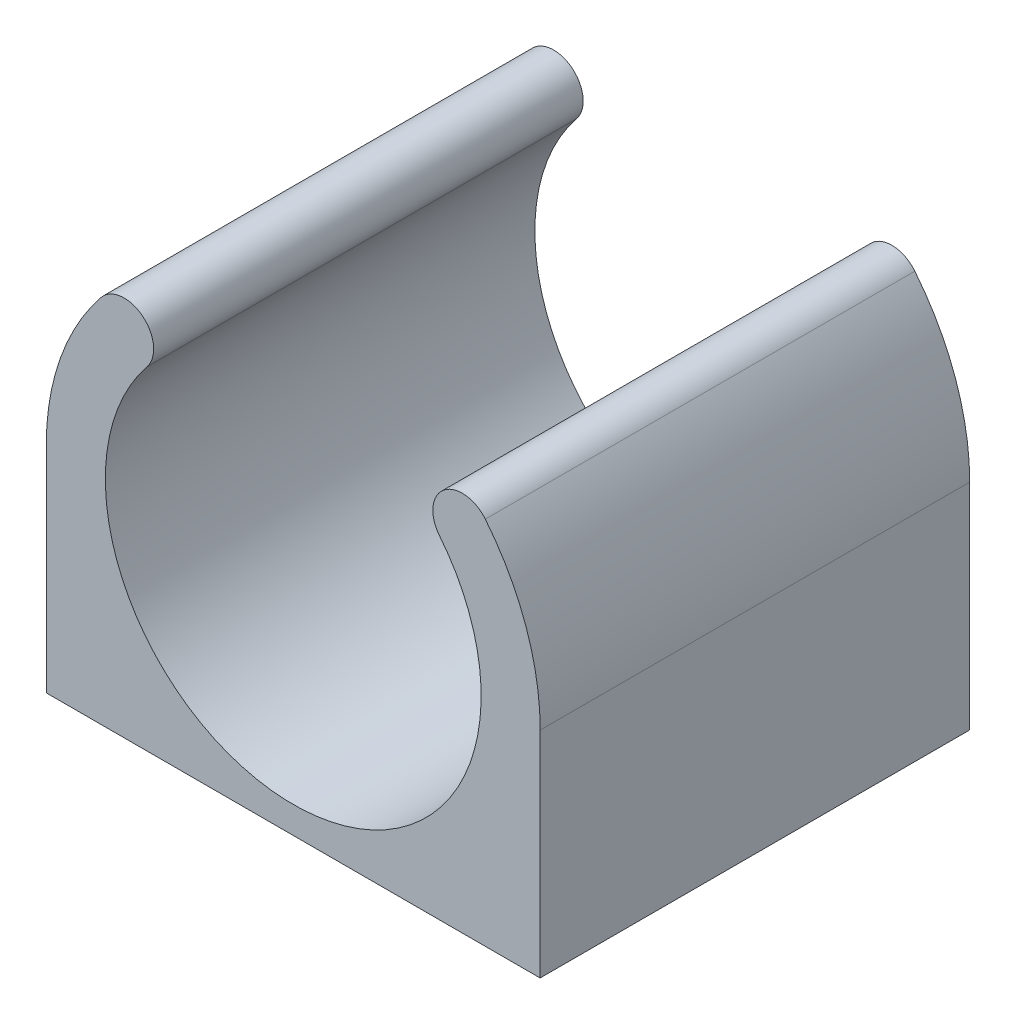
ISO-10303-21;
HEADER;
FILE_DESCRIPTION(('STEP AP214'),'2;1');
FILE_NAME('part.step','',(''),(''),'','','');
FILE_SCHEMA(('AUTOMOTIVE_DESIGN { 1 0 10303 214 1 1 1 1 }'));
ENDSEC;
DATA;
#1=APPLICATION_CONTEXT('core data for automotive mechanical design processes');
#2=APPLICATION_PROTOCOL_DEFINITION('international standard','automotive_design',2000,#1);
#3=PRODUCT_CONTEXT('',#1,'mechanical');
#4=PRODUCT('Part','Part','',(#3));
#5=PRODUCT_RELATED_PRODUCT_CATEGORY('part','',(#4));
#6=PRODUCT_DEFINITION_FORMATION('','',#4);
#7=PRODUCT_DEFINITION_CONTEXT('part definition',#1,'design');
#8=PRODUCT_DEFINITION('design','',#6,#7);
#9=PRODUCT_DEFINITION_SHAPE('','',#8);
#10=(LENGTH_UNIT() NAMED_UNIT(*) SI_UNIT(.MILLI.,.METRE.));
#11=(NAMED_UNIT(*) PLANE_ANGLE_UNIT() SI_UNIT($,.RADIAN.));
#12=(NAMED_UNIT(*) SI_UNIT($,.STERADIAN.) SOLID_ANGLE_UNIT());
#13=UNCERTAINTY_MEASURE_WITH_UNIT(LENGTH_MEASURE(1.E-05),#10,'distance_accuracy_value','');
#14=(GEOMETRIC_REPRESENTATION_CONTEXT(3) GLOBAL_UNCERTAINTY_ASSIGNED_CONTEXT((#13)) GLOBAL_UNIT_ASSIGNED_CONTEXT((#10,
#11,#12)) REPRESENTATION_CONTEXT('',''));
#15=CARTESIAN_POINT('',(0.,0.,0.));
#16=DIRECTION('',(0.,0.,1.));
#17=DIRECTION('',(1.,0.,0.));
#18=AXIS2_PLACEMENT_3D('',#15,#16,#17);
#19=CARTESIAN_POINT('',(2.29908340710687,-2.,4.));
#20=DIRECTION('',(-0.9999998949822,0.000458296398436851,0.));
#21=DIRECTION('',(-0.000458296398436851,-0.9999998949822,0.));
#22=AXIS2_PLACEMENT_3D('',#19,#20,#21);
#23=PLANE('',#22);
#24=DIRECTION('',(0.000458296398436851,0.9999998949822,0.));
#25=VECTOR('',#24,1.);
#26=CARTESIAN_POINT('',(2.29908340710687,-2.,0.));
#27=LINE('',#26,#25);
#28=CARTESIAN_POINT('',(2.29908340710687,-2.,0.));
#29=VERTEX_POINT('',#28);
#30=CARTESIAN_POINT('',(2.3,0.,0.));
#31=VERTEX_POINT('',#30);
#32=EDGE_CURVE('E140',#29,#31,#27,.T.);
#33=ORIENTED_EDGE('',*,*,#32,.T.);
#34=DIRECTION('',(0.,0.,-1.));
#35=VECTOR('',#34,1.);
#36=CARTESIAN_POINT('',(2.3,0.,4.));
#37=LINE('',#36,#35);
#38=CARTESIAN_POINT('',(2.3,0.,4.));
#39=VERTEX_POINT('',#38);
#40=EDGE_CURVE('E11',#39,#31,#37,.T.);
#41=ORIENTED_EDGE('',*,*,#40,.F.);
#42=DIRECTION('',(0.000458296398436851,0.9999998949822,0.));
#43=VECTOR('',#42,1.);
#44=CARTESIAN_POINT('',(2.29908340710687,-2.,4.));
#45=LINE('',#44,#43);
#46=CARTESIAN_POINT('',(2.29908340710687,-2.,4.));
#47=VERTEX_POINT('',#46);
#48=EDGE_CURVE('E162',#47,#39,#45,.T.);
#49=ORIENTED_EDGE('',*,*,#48,.F.);
#50=DIRECTION('',(0.,0.,-1.));
#51=VECTOR('',#50,1.);
#52=CARTESIAN_POINT('',(2.29908340710687,-2.,4.));
#53=LINE('',#52,#51);
#54=EDGE_CURVE('E136',#47,#29,#53,.T.);
#55=ORIENTED_EDGE('',*,*,#54,.T.);
#56=EDGE_LOOP('',(#33,#41,#49,#55));
#57=FACE_BOUND('',#56,.T.);
#58=ADVANCED_FACE('F39',(#57),#23,.F.);
#59=CARTESIAN_POINT('',(0.,0.,4.));
#60=DIRECTION('',(0.,0.,-1.));
#61=DIRECTION('',(-1.,0.,0.));
#62=AXIS2_PLACEMENT_3D('',#59,#60,#61);
#63=CYLINDRICAL_SURFACE('',#62,2.3);
#64=CARTESIAN_POINT('',(0.,0.,0.));
#65=DIRECTION('',(0.,0.,1.));
#66=DIRECTION('',(1.,0.,0.));
#67=AXIS2_PLACEMENT_3D('',#64,#65,#66);
#68=CIRCLE('',#67,2.3);
#69=CARTESIAN_POINT('',(1.78882928310156,1.44571428571429,0.));
#70=VERTEX_POINT('',#69);
#71=EDGE_CURVE('E144',#31,#70,#68,.T.);
#72=ORIENTED_EDGE('',*,*,#71,.T.);
#73=DIRECTION('',(0.,0.,-1.));
#74=VECTOR('',#73,1.);
#75=CARTESIAN_POINT('',(1.78882928310156,1.44571428571429,4.));
#76=LINE('',#75,#74);
#77=CARTESIAN_POINT('',(1.78882928310156,1.44571428571429,4.));
#78=VERTEX_POINT('',#77);
#79=EDGE_CURVE('E48',#78,#70,#76,.T.);
#80=ORIENTED_EDGE('',*,*,#79,.F.);
#81=CARTESIAN_POINT('',(0.,0.,4.));
#82=DIRECTION('',(0.,0.,1.));
#83=DIRECTION('',(1.,0.,0.));
#84=AXIS2_PLACEMENT_3D('',#81,#82,#83);
#85=CIRCLE('',#84,2.3);
#86=EDGE_CURVE('E99',#39,#78,#85,.T.);
#87=ORIENTED_EDGE('',*,*,#86,.F.);
#88=ORIENTED_EDGE('',*,*,#40,.T.);
#89=EDGE_LOOP('',(#72,#80,#87,#88));
#90=FACE_BOUND('',#89,.T.);
#91=ADVANCED_FACE('F208',(#90),#63,.T.);
#92=CARTESIAN_POINT('',(1.57494752099159,1.27285714285714,4.));
#93=DIRECTION('',(0.,0.,-1.));
#94=DIRECTION('',(-1.,0.,0.));
#95=AXIS2_PLACEMENT_3D('',#92,#93,#94);
#96=CYLINDRICAL_SURFACE('',#95,0.275);
#97=CARTESIAN_POINT('',(1.57494752099159,1.27285714285714,0.));
#98=DIRECTION('',(0.,0.,1.));
#99=DIRECTION('',(-1.,0.,0.));
#100=AXIS2_PLACEMENT_3D('',#97,#98,#99);
#101=CIRCLE('',#100,0.275);
#102=CARTESIAN_POINT('',(1.36106575888162,1.1,0.));
#103=VERTEX_POINT('',#102);
#104=EDGE_CURVE('E147',#70,#103,#101,.T.);
#105=ORIENTED_EDGE('',*,*,#104,.T.);
#106=DIRECTION('',(0.,0.,-1.));
#107=VECTOR('',#106,1.);
#108=CARTESIAN_POINT('',(1.36106575888162,1.1,4.));
#109=LINE('',#108,#107);
#110=CARTESIAN_POINT('',(1.36106575888162,1.1,4.));
#111=VERTEX_POINT('',#110);
#112=EDGE_CURVE('E173',#111,#103,#109,.T.);
#113=ORIENTED_EDGE('',*,*,#112,.F.);
#114=CARTESIAN_POINT('',(1.57494752099159,1.27285714285714,4.));
#115=DIRECTION('',(0.,0.,1.));
#116=DIRECTION('',(-1.,0.,0.));
#117=AXIS2_PLACEMENT_3D('',#114,#115,#116);
#118=CIRCLE('',#117,0.275);
#119=EDGE_CURVE('E183',#78,#111,#118,.T.);
#120=ORIENTED_EDGE('',*,*,#119,.F.);
#121=ORIENTED_EDGE('',*,*,#79,.T.);
#122=EDGE_LOOP('',(#105,#113,#120,#121));
#123=FACE_BOUND('',#122,.T.);
#124=ADVANCED_FACE('F181',(#123),#96,.T.);
#125=CARTESIAN_POINT('',(0.,0.,4.));
#126=DIRECTION('',(0.,0.,-1.));
#127=DIRECTION('',(-1.,0.,0.));
#128=AXIS2_PLACEMENT_3D('',#125,#126,#127);
#129=CYLINDRICAL_SURFACE('',#128,1.75);
#130=CARTESIAN_POINT('',(0.,0.,0.));
#131=DIRECTION('',(0.,0.,-1.));
#132=DIRECTION('',(1.,0.,0.));
#133=AXIS2_PLACEMENT_3D('',#130,#131,#132);
#134=CIRCLE('',#133,1.75);
#135=CARTESIAN_POINT('',(-1.36106575888162,1.1,0.));
#136=VERTEX_POINT('',#135);
#137=EDGE_CURVE('E150',#103,#136,#134,.T.);
#138=ORIENTED_EDGE('',*,*,#137,.T.);
#139=DIRECTION('',(0.,0.,-1.));
#140=VECTOR('',#139,1.);
#141=CARTESIAN_POINT('',(-1.36106575888162,1.1,4.));
#142=LINE('',#141,#140);
#143=CARTESIAN_POINT('',(-1.36106575888162,1.1,4.));
#144=VERTEX_POINT('',#143);
#145=EDGE_CURVE('E169',#144,#136,#142,.T.);
#146=ORIENTED_EDGE('',*,*,#145,.F.);
#147=CARTESIAN_POINT('',(0.,0.,4.));
#148=DIRECTION('',(0.,0.,-1.));
#149=DIRECTION('',(1.,0.,0.));
#150=AXIS2_PLACEMENT_3D('',#147,#148,#149);
#151=CIRCLE('',#150,1.75);
#152=EDGE_CURVE('E196',#111,#144,#151,.T.);
#153=ORIENTED_EDGE('',*,*,#152,.F.);
#154=ORIENTED_EDGE('',*,*,#112,.T.);
#155=EDGE_LOOP('',(#138,#146,#153,#154));
#156=FACE_BOUND('',#155,.T.);
#157=ADVANCED_FACE('F191',(#156),#129,.F.);
#158=CARTESIAN_POINT('',(-1.57494752099159,1.27285714285714,4.));
#159=DIRECTION('',(0.,0.,-1.));
#160=DIRECTION('',(-1.,0.,0.));
#161=AXIS2_PLACEMENT_3D('',#158,#159,#160);
#162=CYLINDRICAL_SURFACE('',#161,0.275);
#163=CARTESIAN_POINT('',(-1.57494752099159,1.27285714285714,0.));
#164=DIRECTION('',(0.,0.,1.));
#165=DIRECTION('',(1.,0.,0.));
#166=AXIS2_PLACEMENT_3D('',#163,#164,#165);
#167=CIRCLE('',#166,0.275);
#168=CARTESIAN_POINT('',(-1.78882928310156,1.44571428571429,0.));
#169=VERTEX_POINT('',#168);
#170=EDGE_CURVE('E153',#136,#169,#167,.T.);
#171=ORIENTED_EDGE('',*,*,#170,.T.);
#172=DIRECTION('',(0.,0.,-1.));
#173=VECTOR('',#172,1.);
#174=CARTESIAN_POINT('',(-1.78882928310156,1.44571428571429,4.));
#175=LINE('',#174,#173);
#176=CARTESIAN_POINT('',(-1.78882928310156,1.44571428571429,4.));
#177=VERTEX_POINT('',#176);
#178=EDGE_CURVE('E129',#177,#169,#175,.T.);
#179=ORIENTED_EDGE('',*,*,#178,.F.);
#180=CARTESIAN_POINT('',(-1.57494752099159,1.27285714285714,4.));
#181=DIRECTION('',(0.,0.,1.));
#182=DIRECTION('',(1.,0.,0.));
#183=AXIS2_PLACEMENT_3D('',#180,#181,#182);
#184=CIRCLE('',#183,0.275);
#185=EDGE_CURVE('E118',#144,#177,#184,.T.);
#186=ORIENTED_EDGE('',*,*,#185,.F.);
#187=ORIENTED_EDGE('',*,*,#145,.T.);
#188=EDGE_LOOP('',(#171,#179,#186,#187));
#189=FACE_BOUND('',#188,.T.);
#190=ADVANCED_FACE('F194',(#189),#162,.T.);
#191=CARTESIAN_POINT('',(0.,0.,4.));
#192=DIRECTION('',(0.,0.,-1.));
#193=DIRECTION('',(-1.,0.,0.));
#194=AXIS2_PLACEMENT_3D('',#191,#192,#193);
#195=CYLINDRICAL_SURFACE('',#194,2.3);
#196=CARTESIAN_POINT('',(0.,0.,0.));
#197=DIRECTION('',(0.,0.,1.));
#198=DIRECTION('',(1.,0.,0.));
#199=AXIS2_PLACEMENT_3D('',#196,#197,#198);
#200=CIRCLE('',#199,2.3);
#201=CARTESIAN_POINT('',(-2.3,0.,0.));
#202=VERTEX_POINT('',#201);
#203=EDGE_CURVE('E127',#169,#202,#200,.T.);
#204=ORIENTED_EDGE('',*,*,#203,.T.);
#205=DIRECTION('',(0.,0.,-1.));
#206=VECTOR('',#205,1.);
#207=CARTESIAN_POINT('',(-2.3,0.,4.));
#208=LINE('',#207,#206);
#209=CARTESIAN_POINT('',(-2.3,0.,4.));
#210=VERTEX_POINT('',#209);
#211=EDGE_CURVE('E124',#210,#202,#208,.T.);
#212=ORIENTED_EDGE('',*,*,#211,.F.);
#213=CARTESIAN_POINT('',(0.,0.,4.));
#214=DIRECTION('',(0.,0.,1.));
#215=DIRECTION('',(1.,0.,0.));
#216=AXIS2_PLACEMENT_3D('',#213,#214,#215);
#217=CIRCLE('',#216,2.3);
#218=EDGE_CURVE('E112',#177,#210,#217,.T.);
#219=ORIENTED_EDGE('',*,*,#218,.F.);
#220=ORIENTED_EDGE('',*,*,#178,.T.);
#221=EDGE_LOOP('',(#204,#212,#219,#220));
#222=FACE_BOUND('',#221,.T.);
#223=ADVANCED_FACE('F125',(#222),#195,.T.);
#224=CARTESIAN_POINT('',(-2.29908340710687,-2.,4.));
#225=DIRECTION('',(0.9999998949822,0.000458296398437288,0.));
#226=DIRECTION('',(-0.000458296398437288,0.9999998949822,0.));
#227=AXIS2_PLACEMENT_3D('',#224,#225,#226);
#228=PLANE('',#227);
#229=DIRECTION('',(0.000458296398437288,-0.9999998949822,0.));
#230=VECTOR('',#229,1.);
#231=CARTESIAN_POINT('',(-2.29908340710687,-2.,0.));
#232=LINE('',#231,#230);
#233=CARTESIAN_POINT('',(-2.29908340710687,-2.,0.));
#234=VERTEX_POINT('',#233);
#235=EDGE_CURVE('E85',#202,#234,#232,.T.);
#236=ORIENTED_EDGE('',*,*,#235,.T.);
#237=DIRECTION('',(0.,0.,-1.));
#238=VECTOR('',#237,1.);
#239=CARTESIAN_POINT('',(-2.29908340710687,-2.,4.));
#240=LINE('',#239,#238);
#241=CARTESIAN_POINT('',(-2.29908340710687,-2.,4.));
#242=VERTEX_POINT('',#241);
#243=EDGE_CURVE('E130',#242,#234,#240,.T.);
#244=ORIENTED_EDGE('',*,*,#243,.F.);
#245=DIRECTION('',(0.000458296398437288,-0.9999998949822,0.));
#246=VECTOR('',#245,1.);
#247=CARTESIAN_POINT('',(-2.29908340710687,-2.,4.));
#248=LINE('',#247,#246);
#249=EDGE_CURVE('E116',#210,#242,#248,.T.);
#250=ORIENTED_EDGE('',*,*,#249,.F.);
#251=ORIENTED_EDGE('',*,*,#211,.T.);
#252=EDGE_LOOP('',(#236,#244,#250,#251));
#253=FACE_BOUND('',#252,.T.);
#254=ADVANCED_FACE('F132',(#253),#228,.F.);
#255=CARTESIAN_POINT('',(-2.29908340710687,-2.,4.));
#256=DIRECTION('',(0.,1.,0.));
#257=DIRECTION('',(0.,0.,1.));
#258=AXIS2_PLACEMENT_3D('',#255,#256,#257);
#259=PLANE('',#258);
#260=DIRECTION('',(1.,0.,0.));
#261=VECTOR('',#260,1.);
#262=CARTESIAN_POINT('',(-2.29908340710687,-2.,0.));
#263=LINE('',#262,#261);
#264=EDGE_CURVE('E91',#234,#29,#263,.T.);
#265=ORIENTED_EDGE('',*,*,#264,.T.);
#266=ORIENTED_EDGE('',*,*,#54,.F.);
#267=DIRECTION('',(1.,0.,0.));
#268=VECTOR('',#267,1.);
#269=CARTESIAN_POINT('',(-2.29908340710687,-2.,4.));
#270=LINE('',#269,#268);
#271=EDGE_CURVE('E56',#242,#47,#270,.T.);
#272=ORIENTED_EDGE('',*,*,#271,.F.);
#273=ORIENTED_EDGE('',*,*,#243,.T.);
#274=EDGE_LOOP('',(#265,#266,#272,#273));
#275=FACE_BOUND('',#274,.T.);
#276=ADVANCED_FACE('F224',(#275),#259,.F.);
#277=CARTESIAN_POINT('',(0.,0.,4.));
#278=DIRECTION('',(0.,0.,1.));
#279=DIRECTION('',(1.,0.,0.));
#280=AXIS2_PLACEMENT_3D('',#277,#278,#279);
#281=PLANE('',#280);
#282=ORIENTED_EDGE('',*,*,#48,.T.);
#283=ORIENTED_EDGE('',*,*,#86,.T.);
#284=ORIENTED_EDGE('',*,*,#119,.T.);
#285=ORIENTED_EDGE('',*,*,#152,.T.);
#286=ORIENTED_EDGE('',*,*,#185,.T.);
#287=ORIENTED_EDGE('',*,*,#218,.T.);
#288=ORIENTED_EDGE('',*,*,#249,.T.);
#289=ORIENTED_EDGE('',*,*,#271,.T.);
#290=EDGE_LOOP('',(#282,#283,#284,#285,#286,#287,#288,#289));
#291=FACE_BOUND('',#290,.T.);
#292=ADVANCED_FACE('F114',(#291),#281,.T.);
#293=CARTESIAN_POINT('',(0.,0.,0.));
#294=DIRECTION('',(0.,0.,1.));
#295=DIRECTION('',(1.,0.,0.));
#296=AXIS2_PLACEMENT_3D('',#293,#294,#295);
#297=PLANE('',#296);
#298=ORIENTED_EDGE('',*,*,#32,.F.);
#299=ORIENTED_EDGE('',*,*,#264,.F.);
#300=ORIENTED_EDGE('',*,*,#235,.F.);
#301=ORIENTED_EDGE('',*,*,#203,.F.);
#302=ORIENTED_EDGE('',*,*,#170,.F.);
#303=ORIENTED_EDGE('',*,*,#137,.F.);
#304=ORIENTED_EDGE('',*,*,#104,.F.);
#305=ORIENTED_EDGE('',*,*,#71,.F.);
#306=EDGE_LOOP('',(#298,#299,#300,#301,#302,#303,#304,#305));
#307=FACE_BOUND('',#306,.T.);
#308=ADVANCED_FACE('F187',(#307),#297,.F.);
#309=CLOSED_SHELL('',(#58,#91,#124,#157,#190,#223,#254,#276,#292,#308));
#310=MANIFOLD_SOLID_BREP('B2',#309);
#311=ADVANCED_BREP_SHAPE_REPRESENTATION('',(#18,#310),#14);
#312=SHAPE_DEFINITION_REPRESENTATION(#9,#311);
ENDSEC;
END-ISO-10303-21;
